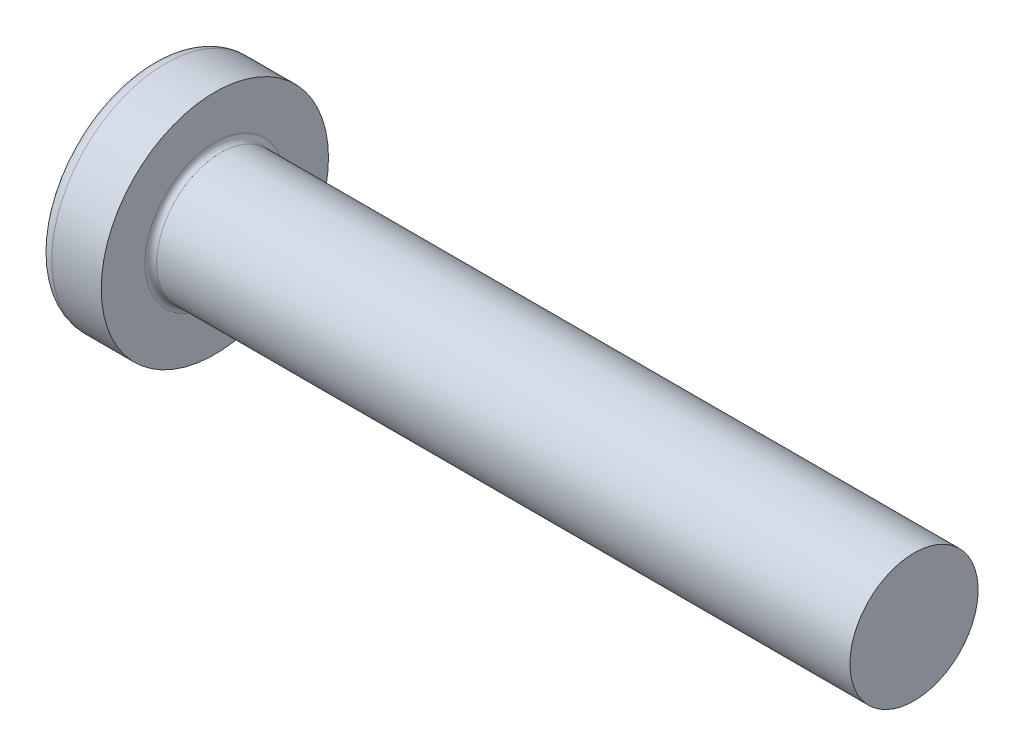
ISO-10303-21;
HEADER;
FILE_DESCRIPTION(('STEP AP214'),'2;1');
FILE_NAME('part.step','',(''),(''),'','','');
FILE_SCHEMA(('AUTOMOTIVE_DESIGN { 1 0 10303 214 1 1 1 1 }'));
ENDSEC;
DATA;
#1=APPLICATION_CONTEXT('core data for automotive mechanical design processes');
#2=APPLICATION_PROTOCOL_DEFINITION('international standard','automotive_design',2000,#1);
#3=PRODUCT_CONTEXT('',#1,'mechanical');
#4=PRODUCT('Part','Part','',(#3));
#5=PRODUCT_RELATED_PRODUCT_CATEGORY('part','',(#4));
#6=PRODUCT_DEFINITION_FORMATION('','',#4);
#7=PRODUCT_DEFINITION_CONTEXT('part definition',#1,'design');
#8=PRODUCT_DEFINITION('design','',#6,#7);
#9=PRODUCT_DEFINITION_SHAPE('','',#8);
#10=(LENGTH_UNIT() NAMED_UNIT(*) SI_UNIT(.MILLI.,.METRE.));
#11=(NAMED_UNIT(*) PLANE_ANGLE_UNIT() SI_UNIT($,.RADIAN.));
#12=(NAMED_UNIT(*) SI_UNIT($,.STERADIAN.) SOLID_ANGLE_UNIT());
#13=UNCERTAINTY_MEASURE_WITH_UNIT(LENGTH_MEASURE(1.E-05),#10,'distance_accuracy_value','');
#14=(GEOMETRIC_REPRESENTATION_CONTEXT(3) GLOBAL_UNCERTAINTY_ASSIGNED_CONTEXT((#13)) GLOBAL_UNIT_ASSIGNED_CONTEXT((#10,
#11,#12)) REPRESENTATION_CONTEXT('',''));
#15=CARTESIAN_POINT('',(0.,0.,0.));
#16=DIRECTION('',(0.,0.,1.));
#17=DIRECTION('',(1.,0.,0.));
#18=AXIS2_PLACEMENT_3D('',#15,#16,#17);
#19=CARTESIAN_POINT('',(1.2,0.601702090980209,-0.3));
#20=DIRECTION('',(-1.,0.,0.));
#21=DIRECTION('',(0.,0.,1.));
#22=AXIS2_PLACEMENT_3D('',#19,#20,#21);
#23=PLANE('',#22);
#24=DIRECTION('',(0.,0.,-1.));
#25=VECTOR('',#24,1.);
#26=CARTESIAN_POINT('',(1.2,0.299999999999998,0.60170209098021));
#27=LINE('',#26,#25);
#28=CARTESIAN_POINT('',(1.2,0.300000000000002,-0.601702090980208));
#29=VERTEX_POINT('',#28);
#30=CARTESIAN_POINT('',(1.19999999999144,0.300000000000002,-0.468119642828335));
#31=VERTEX_POINT('',#30);
#32=EDGE_CURVE('E271',#29,#31,#27,.F.);
#33=ORIENTED_EDGE('',*,*,#32,.F.);
#34=DIRECTION('',(0.,1.,0.));
#35=VECTOR('',#34,1.);
#36=CARTESIAN_POINT('',(1.2,0.300000000000004,-0.601702090980208));
#37=LINE('',#36,#35);
#38=CARTESIAN_POINT('',(1.2,-0.299999999999998,-0.60170209098021));
#39=VERTEX_POINT('',#38);
#40=EDGE_CURVE('E276',#29,#39,#37,.F.);
#41=ORIENTED_EDGE('',*,*,#40,.T.);
#42=DIRECTION('',(0.,0.,1.));
#43=VECTOR('',#42,1.);
#44=CARTESIAN_POINT('',(1.2,-0.299999999999998,-0.601702090980211));
#45=LINE('',#44,#43);
#46=CARTESIAN_POINT('',(1.19999999999144,-0.299999999999999,-0.468119642828337));
#47=VERTEX_POINT('',#46);
#48=EDGE_CURVE('E323',#47,#39,#45,.F.);
#49=ORIENTED_EDGE('',*,*,#48,.F.);
#50=CARTESIAN_POINT('',(1.19999999999988,0.,0.));
#51=DIRECTION('',(-1.,0.,0.));
#52=DIRECTION('',(0.,0.,1.));
#53=AXIS2_PLACEMENT_3D('',#50,#51,#52);
#54=CIRCLE('',#53,0.556000000000001);
#55=EDGE_CURVE('E545',#47,#31,#54,.F.);
#56=ORIENTED_EDGE('',*,*,#55,.T.);
#57=EDGE_LOOP('',(#33,#41,#49,#56));
#58=FACE_BOUND('',#57,.T.);
#59=ADVANCED_FACE('F18',(#58),#23,.T.);
#60=CARTESIAN_POINT('',(1.2,0.601702090980209,-0.3));
#61=DIRECTION('',(-1.,0.,0.));
#62=DIRECTION('',(0.,0.,1.));
#63=AXIS2_PLACEMENT_3D('',#60,#61,#62);
#64=PLANE('',#63);
#65=DIRECTION('',(0.,1.,0.));
#66=VECTOR('',#65,1.);
#67=CARTESIAN_POINT('',(1.2,-0.60170209098021,0.3));
#68=LINE('',#67,#66);
#69=CARTESIAN_POINT('',(1.2,0.601702090980209,0.3));
#70=VERTEX_POINT('',#69);
#71=CARTESIAN_POINT('',(1.19999999999144,0.468119642828336,0.3));
#72=VERTEX_POINT('',#71);
#73=EDGE_CURVE('E141',#70,#72,#68,.F.);
#74=ORIENTED_EDGE('',*,*,#73,.F.);
#75=DIRECTION('',(0.,0.,1.));
#76=VECTOR('',#75,1.);
#77=CARTESIAN_POINT('',(1.2,0.601702090980209,0.3));
#78=LINE('',#77,#76);
#79=CARTESIAN_POINT('',(1.2,0.601702090980209,-0.3));
#80=VERTEX_POINT('',#79);
#81=EDGE_CURVE('E264',#70,#80,#78,.F.);
#82=ORIENTED_EDGE('',*,*,#81,.T.);
#83=DIRECTION('',(0.,1.,0.));
#84=VECTOR('',#83,1.);
#85=CARTESIAN_POINT('',(1.2,0.601702090980209,-0.3));
#86=LINE('',#85,#84);
#87=CARTESIAN_POINT('',(1.19999999999144,0.468119642828336,-0.3));
#88=VERTEX_POINT('',#87);
#89=EDGE_CURVE('E144',#88,#80,#86,.T.);
#90=ORIENTED_EDGE('',*,*,#89,.F.);
#91=CARTESIAN_POINT('',(1.19999999999988,0.,0.));
#92=DIRECTION('',(-1.,0.,0.));
#93=DIRECTION('',(0.,0.,1.));
#94=AXIS2_PLACEMENT_3D('',#91,#92,#93);
#95=CIRCLE('',#94,0.556000000000001);
#96=EDGE_CURVE('E138',#88,#72,#95,.F.);
#97=ORIENTED_EDGE('',*,*,#96,.T.);
#98=EDGE_LOOP('',(#74,#82,#90,#97));
#99=FACE_BOUND('',#98,.T.);
#100=ADVANCED_FACE('F140',(#99),#64,.T.);
#101=CARTESIAN_POINT('',(1.2,0.601702090980209,-0.3));
#102=DIRECTION('',(-1.,0.,0.));
#103=DIRECTION('',(0.,0.,1.));
#104=AXIS2_PLACEMENT_3D('',#101,#102,#103);
#105=PLANE('',#104);
#106=DIRECTION('',(0.,0.,1.));
#107=VECTOR('',#106,1.);
#108=CARTESIAN_POINT('',(1.2,-0.299999999999998,-0.601702090980211));
#109=LINE('',#108,#107);
#110=CARTESIAN_POINT('',(1.2,-0.300000000000002,0.601702090980208));
#111=VERTEX_POINT('',#110);
#112=CARTESIAN_POINT('',(1.19999999999144,-0.300000000000002,0.468119642828335));
#113=VERTEX_POINT('',#112);
#114=EDGE_CURVE('E252',#111,#113,#109,.F.);
#115=ORIENTED_EDGE('',*,*,#114,.F.);
#116=DIRECTION('',(0.,1.,0.));
#117=VECTOR('',#116,1.);
#118=CARTESIAN_POINT('',(1.2,-0.300000000000002,0.601702090980208));
#119=LINE('',#118,#117);
#120=CARTESIAN_POINT('',(1.2,0.299999999999998,0.60170209098021));
#121=VERTEX_POINT('',#120);
#122=EDGE_CURVE('E257',#111,#121,#119,.T.);
#123=ORIENTED_EDGE('',*,*,#122,.T.);
#124=DIRECTION('',(0.,0.,-1.));
#125=VECTOR('',#124,1.);
#126=CARTESIAN_POINT('',(1.2,0.299999999999998,0.60170209098021));
#127=LINE('',#126,#125);
#128=CARTESIAN_POINT('',(1.19999999999144,0.299999999999999,0.468119642828338));
#129=VERTEX_POINT('',#128);
#130=EDGE_CURVE('E301',#129,#121,#127,.F.);
#131=ORIENTED_EDGE('',*,*,#130,.F.);
#132=CARTESIAN_POINT('',(1.19999999999988,0.,0.));
#133=DIRECTION('',(-1.,0.,0.));
#134=DIRECTION('',(0.,0.,1.));
#135=AXIS2_PLACEMENT_3D('',#132,#133,#134);
#136=CIRCLE('',#135,0.556000000000001);
#137=EDGE_CURVE('E150',#129,#113,#136,.F.);
#138=ORIENTED_EDGE('',*,*,#137,.T.);
#139=EDGE_LOOP('',(#115,#123,#131,#138));
#140=FACE_BOUND('',#139,.T.);
#141=ADVANCED_FACE('F560',(#140),#105,.T.);
#142=CARTESIAN_POINT('',(1.20000000000031,0.,0.));
#143=DIRECTION('',(-1.,0.,0.));
#144=DIRECTION('',(0.,0.,1.));
#145=AXIS2_PLACEMENT_3D('',#142,#143,#144);
#146=CONICAL_SURFACE('',#145,0.555999999998669,1.25663706143256);
#147=CARTESIAN_POINT('',(1.38065535110554,0.,0.));
#148=VERTEX_POINT('',#147);
#149=VERTEX_LOOP('',#148);
#150=FACE_BOUND('',#149,.T.);
#151=CARTESIAN_POINT('',(1.19999999998299,0.,0.));
#152=DIRECTION('',(-1.,0.,0.));
#153=DIRECTION('',(0.,0.,1.));
#154=AXIS2_PLACEMENT_3D('',#151,#152,#153);
#155=CIRCLE('',#154,0.55600000000311);
#156=EDGE_CURVE('E270',#88,#31,#155,.T.);
#157=ORIENTED_EDGE('',*,*,#156,.T.);
#158=ORIENTED_EDGE('',*,*,#55,.F.);
#159=CARTESIAN_POINT('',(1.19999999998299,0.,0.));
#160=DIRECTION('',(-1.,0.,0.));
#161=DIRECTION('',(0.,0.,1.));
#162=AXIS2_PLACEMENT_3D('',#159,#160,#161);
#163=CIRCLE('',#162,0.55600000000311);
#164=CARTESIAN_POINT('',(1.19999999999144,-0.468119642828336,-0.300000000000001));
#165=VERTEX_POINT('',#164);
#166=EDGE_CURVE('E331',#47,#165,#163,.T.);
#167=ORIENTED_EDGE('',*,*,#166,.T.);
#168=CARTESIAN_POINT('',(1.19999999999988,0.,0.));
#169=DIRECTION('',(-1.,0.,0.));
#170=DIRECTION('',(0.,0.,1.));
#171=AXIS2_PLACEMENT_3D('',#168,#169,#170);
#172=CIRCLE('',#171,0.556000000000001);
#173=CARTESIAN_POINT('',(1.19999999999144,-0.468119642828336,0.3));
#174=VERTEX_POINT('',#173);
#175=EDGE_CURVE('E291',#174,#165,#172,.F.);
#176=ORIENTED_EDGE('',*,*,#175,.F.);
#177=CARTESIAN_POINT('',(1.19999999998299,0.,0.));
#178=DIRECTION('',(-1.,0.,0.));
#179=DIRECTION('',(0.,0.,1.));
#180=AXIS2_PLACEMENT_3D('',#177,#178,#179);
#181=CIRCLE('',#180,0.55600000000311);
#182=EDGE_CURVE('E251',#174,#113,#181,.T.);
#183=ORIENTED_EDGE('',*,*,#182,.T.);
#184=ORIENTED_EDGE('',*,*,#137,.F.);
#185=CARTESIAN_POINT('',(1.19999999998299,0.,0.));
#186=DIRECTION('',(-1.,0.,0.));
#187=DIRECTION('',(0.,0.,1.));
#188=AXIS2_PLACEMENT_3D('',#185,#186,#187);
#189=CIRCLE('',#188,0.55600000000311);
#190=EDGE_CURVE('E163',#129,#72,#189,.T.);
#191=ORIENTED_EDGE('',*,*,#190,.T.);
#192=ORIENTED_EDGE('',*,*,#96,.F.);
#193=EDGE_LOOP('',(#157,#158,#167,#176,#183,#184,#191,#192));
#194=FACE_BOUND('',#193,.T.);
#195=ADVANCED_FACE('F164',(#150,#194),#146,.F.);
#196=CARTESIAN_POINT('',(1.2,0.601702090980209,-0.3));
#197=DIRECTION('',(-1.,0.,0.));
#198=DIRECTION('',(0.,0.,1.));
#199=AXIS2_PLACEMENT_3D('',#196,#197,#198);
#200=PLANE('',#199);
#201=DIRECTION('',(0.,1.,0.));
#202=VECTOR('',#201,1.);
#203=CARTESIAN_POINT('',(1.2,0.601702090980209,-0.3));
#204=LINE('',#203,#202);
#205=CARTESIAN_POINT('',(1.2,-0.601702090980209,-0.3));
#206=VERTEX_POINT('',#205);
#207=EDGE_CURVE('E287',#206,#165,#204,.T.);
#208=ORIENTED_EDGE('',*,*,#207,.F.);
#209=DIRECTION('',(0.,0.,1.));
#210=VECTOR('',#209,1.);
#211=CARTESIAN_POINT('',(1.2,-0.601702090980209,-0.3));
#212=LINE('',#211,#210);
#213=CARTESIAN_POINT('',(1.2,-0.601702090980209,0.3));
#214=VERTEX_POINT('',#213);
#215=EDGE_CURVE('E239',#206,#214,#212,.T.);
#216=ORIENTED_EDGE('',*,*,#215,.T.);
#217=DIRECTION('',(0.,1.,0.));
#218=VECTOR('',#217,1.);
#219=CARTESIAN_POINT('',(1.2,-0.60170209098021,0.3));
#220=LINE('',#219,#218);
#221=EDGE_CURVE('E245',#174,#214,#220,.F.);
#222=ORIENTED_EDGE('',*,*,#221,.F.);
#223=ORIENTED_EDGE('',*,*,#175,.T.);
#224=EDGE_LOOP('',(#208,#216,#222,#223));
#225=FACE_BOUND('',#224,.T.);
#226=ADVANCED_FACE('F549',(#225),#200,.T.);
#227=CARTESIAN_POINT('',(1.2,0.601702090980209,-0.3));
#228=DIRECTION('',(0.,0.,1.));
#229=DIRECTION('',(1.,0.,0.));
#230=AXIS2_PLACEMENT_3D('',#227,#228,#229);
#231=PLANE('',#230);
#232=CARTESIAN_POINT('',(0.170303564593852,-1.1150897778374,-0.300000000000001));
#233=CARTESIAN_POINT('',(0.143844871789511,-1.02418894622975,-0.300000000000001));
#234=CARTESIAN_POINT('',(0.120668732118598,-0.932580739405694,-0.300000000000001));
#235=CARTESIAN_POINT('',(0.0808815590436282,-0.747949575324762,-0.299999999999999));
#236=CARTESIAN_POINT('',(0.0642705256395715,-0.654926618067887,-0.299999999999998));
#237=CARTESIAN_POINT('',(0.050942045368943,-0.561196285594605,-0.299999999999996));
#238=B_SPLINE_CURVE_WITH_KNOTS('',3,(#232,#233,#234,#235,#236,#237),.UNSPECIFIED.,.F.,.F.,(4,2,
4),(0.,0.283483285341631,0.566966570683263),.UNSPECIFIED.);
#239=CARTESIAN_POINT('',(0.170303564593852,-1.1150897778374,-0.3));
#240=VERTEX_POINT('',#239);
#241=CARTESIAN_POINT('',(0.0509420453854122,-0.561196285594247,-0.3));
#242=VERTEX_POINT('',#241);
#243=EDGE_CURVE('E238',#240,#242,#238,.T.);
#244=ORIENTED_EDGE('',*,*,#243,.F.);
#245=DIRECTION('',(0.89493436774996,0.446197800778958,0.));
#246=VECTOR('',#245,1.);
#247=CARTESIAN_POINT('',(0.,-1.2,-0.3));
#248=LINE('',#247,#246);
#249=EDGE_CURVE('E242',#240,#206,#248,.T.);
#250=ORIENTED_EDGE('',*,*,#249,.T.);
#251=ORIENTED_EDGE('',*,*,#207,.T.);
#252=CARTESIAN_POINT('',(1.19999999999161,-0.468119642829467,-0.3));
#253=CARTESIAN_POINT('',(1.00851907507673,-0.483987286215539,-0.3));
#254=CARTESIAN_POINT('',(0.817023777523635,-0.499677495244487,-0.3));
#255=CARTESIAN_POINT('',(0.434004459316412,-0.530703042791877,-0.3));
#256=CARTESIAN_POINT('',(0.242480438665611,-0.546038381351409,-0.3));
#257=CARTESIAN_POINT('',(0.0509420453799313,-0.561196285594909,-0.3));
#258=B_SPLINE_CURVE_WITH_KNOTS('',3,(#252,#253,#254,#255,#256,#257),.UNSPECIFIED.,.F.,.F.,(4,2,
4),(0.,0.576411038061277,1.15282200937849),.UNSPECIFIED.);
#259=EDGE_CURVE('E290',#165,#242,#258,.T.);
#260=ORIENTED_EDGE('',*,*,#259,.T.);
#261=EDGE_LOOP('',(#244,#250,#251,#260));
#262=FACE_BOUND('',#261,.T.);
#263=ADVANCED_FACE('F471',(#262),#231,.T.);
#264=CARTESIAN_POINT('',(0.0509420453909115,0.,0.));
#265=DIRECTION('',(-1.,0.,0.));
#266=DIRECTION('',(0.,0.,1.));
#267=AXIS2_PLACEMENT_3D('',#264,#265,#266);
#268=CONICAL_SURFACE('',#267,0.636349959506788,0.0698131700803994);
#269=CARTESIAN_POINT('',(0.0509420453725655,-0.299999999999998,-0.561196285595267));
#270=CARTESIAN_POINT('',(0.242480438660424,-0.299999999999998,-0.546038381351641));
#271=CARTESIAN_POINT('',(0.434004459313407,-0.299999999999998,-0.530703042792013));
#272=CARTESIAN_POINT('',(0.817023777524997,-0.299999999999998,-0.499677495244487));
#273=CARTESIAN_POINT('',(1.00851907508028,-0.299999999999998,-0.4839872862155));
#274=CARTESIAN_POINT('',(1.19999999999735,-0.299999999999998,-0.468119642829418));
#275=B_SPLINE_CURVE_WITH_KNOTS('',3,(#269,#270,#271,#272,#273,#274),.UNSPECIFIED.,.F.,.F.,(4,2,
4),(0.,0.576410971323761,1.15282200939158),.UNSPECIFIED.);
#276=CARTESIAN_POINT('',(0.0509420453817383,-0.299999999999998,-0.561196285633383));
#277=VERTEX_POINT('',#276);
#278=EDGE_CURVE('E328',#277,#47,#275,.T.);
#279=ORIENTED_EDGE('',*,*,#278,.F.);
#280=CARTESIAN_POINT('',(0.0509420453909115,0.,0.));
#281=DIRECTION('',(-1.,0.,0.));
#282=DIRECTION('',(0.,0.,1.));
#283=AXIS2_PLACEMENT_3D('',#280,#281,#282);
#284=CIRCLE('',#283,0.636349959506788);
#285=EDGE_CURVE('E463',#242,#277,#284,.F.);
#286=ORIENTED_EDGE('',*,*,#285,.F.);
#287=ORIENTED_EDGE('',*,*,#259,.F.);
#288=ORIENTED_EDGE('',*,*,#166,.F.);
#289=EDGE_LOOP('',(#279,#286,#287,#288));
#290=FACE_BOUND('',#289,.T.);
#291=ADVANCED_FACE('F444',(#290),#268,.F.);
#292=CARTESIAN_POINT('',(1.2,-0.299999999999998,-0.601702090980211));
#293=DIRECTION('',(0.,1.,0.));
#294=DIRECTION('',(0.,0.,1.));
#295=AXIS2_PLACEMENT_3D('',#292,#293,#294);
#296=PLANE('',#295);
#297=ORIENTED_EDGE('',*,*,#48,.T.);
#298=DIRECTION('',(-0.89493436774996,0.,-0.446197800778958));
#299=VECTOR('',#298,1.);
#300=CARTESIAN_POINT('',(0.,-0.299999999999998,-1.2));
#301=LINE('',#300,#299);
#302=CARTESIAN_POINT('',(0.170303564593854,-0.299999999999997,-1.1150897778374));
#303=VERTEX_POINT('',#302);
#304=EDGE_CURVE('E274',#39,#303,#301,.T.);
#305=ORIENTED_EDGE('',*,*,#304,.T.);
#306=CARTESIAN_POINT('',(4.,-0.299999999999998,0.));
#307=DIRECTION('',(0.,1.,0.));
#308=DIRECTION('',(0.,0.,1.));
#309=AXIS2_PLACEMENT_3D('',#306,#307,#308);
#310=CIRCLE('',#309,3.98873413503583);
#311=EDGE_CURVE('E461',#277,#303,#310,.F.);
#312=ORIENTED_EDGE('',*,*,#311,.F.);
#313=ORIENTED_EDGE('',*,*,#278,.T.);
#314=EDGE_LOOP('',(#297,#305,#312,#313));
#315=FACE_BOUND('',#314,.T.);
#316=ADVANCED_FACE('F446',(#315),#296,.T.);
#317=CARTESIAN_POINT('',(0.,0.300000000000004,-1.2));
#318=DIRECTION('',(0.446197800778958,0.,-0.89493436774996));
#319=DIRECTION('',(-0.89493436774996,0.,-0.446197800778958));
#320=AXIS2_PLACEMENT_3D('',#317,#318,#319);
#321=PLANE('',#320);
#322=ORIENTED_EDGE('',*,*,#40,.F.);
#323=DIRECTION('',(0.89493436774996,0.,0.446197800778958));
#324=VECTOR('',#323,1.);
#325=CARTESIAN_POINT('',(0.170303564593855,0.300000000000004,-1.1150897778374));
#326=LINE('',#325,#324);
#327=CARTESIAN_POINT('',(0.170303564593854,0.300000000000007,-1.1150897778374));
#328=VERTEX_POINT('',#327);
#329=EDGE_CURVE('E267',#328,#29,#326,.T.);
#330=ORIENTED_EDGE('',*,*,#329,.F.);
#331=CARTESIAN_POINT('',(0.170303564593854,-0.299999999999996,-1.1150897778374));
#332=CARTESIAN_POINT('',(0.163473050626689,-0.199999999999996,-1.11849534635747));
#333=CARTESIAN_POINT('',(0.160057793643106,-0.0999999999999963,-1.12019813061751));
#334=CARTESIAN_POINT('',(0.160057793643106,0.100000000000004,-1.12019813061751));
#335=CARTESIAN_POINT('',(0.163473050626689,0.200000000000004,-1.11849534635747));
#336=CARTESIAN_POINT('',(0.170303564593854,0.300000000000004,-1.1150897778374));
#337=B_SPLINE_CURVE_WITH_KNOTS('',3,(#331,#332,#333,#334,#335,#336),.UNSPECIFIED.,.F.,.F.,(4,2,
4),(0.,0.300218372340037,0.600436744680075),.UNSPECIFIED.);
#338=EDGE_CURVE('E455',#303,#328,#337,.T.);
#339=ORIENTED_EDGE('',*,*,#338,.F.);
#340=ORIENTED_EDGE('',*,*,#304,.F.);
#341=EDGE_LOOP('',(#322,#330,#339,#340));
#342=FACE_BOUND('',#341,.T.);
#343=ADVANCED_FACE('F449',(#342),#321,.F.);
#344=CARTESIAN_POINT('',(1.2,0.299999999999998,0.60170209098021));
#345=DIRECTION('',(0.,-1.,0.));
#346=DIRECTION('',(0.,0.,-1.));
#347=AXIS2_PLACEMENT_3D('',#344,#345,#346);
#348=PLANE('',#347);
#349=CARTESIAN_POINT('',(4.,0.300000000000004,0.));
#350=DIRECTION('',(0.,1.,0.));
#351=DIRECTION('',(0.,0.,1.));
#352=AXIS2_PLACEMENT_3D('',#349,#350,#351);
#353=CIRCLE('',#352,3.98873413503583);
#354=CARTESIAN_POINT('',(0.0509420453854116,0.300000000000003,-0.56119628563309));
#355=VERTEX_POINT('',#354);
#356=EDGE_CURVE('E409',#328,#355,#353,.T.);
#357=ORIENTED_EDGE('',*,*,#356,.F.);
#358=ORIENTED_EDGE('',*,*,#329,.T.);
#359=ORIENTED_EDGE('',*,*,#32,.T.);
#360=CARTESIAN_POINT('',(1.1999999999916,0.300000000000002,-0.468119642829467));
#361=CARTESIAN_POINT('',(1.00851907507671,0.300000000000002,-0.483987286215539));
#362=CARTESIAN_POINT('',(0.817023777523623,0.300000000000002,-0.499677495244487));
#363=CARTESIAN_POINT('',(0.434004459316406,0.300000000000002,-0.530703042791877));
#364=CARTESIAN_POINT('',(0.242480438665608,0.300000000000002,-0.546038381351408));
#365=CARTESIAN_POINT('',(0.0509420453799307,0.300000000000002,-0.561196285594908));
#366=B_SPLINE_CURVE_WITH_KNOTS('',3,(#360,#361,#362,#363,#364,#365),.UNSPECIFIED.,.F.,.F.,(4,2,
4),(0.,0.576411038061268,1.15282200937847),.UNSPECIFIED.);
#367=EDGE_CURVE('E317',#31,#355,#366,.T.);
#368=ORIENTED_EDGE('',*,*,#367,.T.);
#369=EDGE_LOOP('',(#357,#358,#359,#368));
#370=FACE_BOUND('',#369,.T.);
#371=ADVANCED_FACE('F424',(#370),#348,.T.);
#372=CARTESIAN_POINT('',(0.0509420453909115,0.,0.));
#373=DIRECTION('',(-1.,0.,0.));
#374=DIRECTION('',(0.,0.,1.));
#375=AXIS2_PLACEMENT_3D('',#372,#373,#374);
#376=CONICAL_SURFACE('',#375,0.636349959506788,0.0698131700803994);
#377=ORIENTED_EDGE('',*,*,#367,.F.);
#378=ORIENTED_EDGE('',*,*,#156,.F.);
#379=CARTESIAN_POINT('',(0.0509420453725669,0.561196285595266,-0.3));
#380=CARTESIAN_POINT('',(0.242480438660426,0.54603838135164,-0.3));
#381=CARTESIAN_POINT('',(0.434004459313408,0.530703042792011,-0.3));
#382=CARTESIAN_POINT('',(0.817023777524997,0.499677495244486,-0.3));
#383=CARTESIAN_POINT('',(1.00851907508028,0.483987286215499,-0.3));
#384=CARTESIAN_POINT('',(1.19999999999735,0.468119642829417,-0.3));
#385=B_SPLINE_CURVE_WITH_KNOTS('',3,(#379,#380,#381,#382,#383,#384),.UNSPECIFIED.,.F.,.F.,(4,2,
4),(0.,0.57641097132376,1.15282200939158),.UNSPECIFIED.);
#386=CARTESIAN_POINT('',(0.0509420453706864,0.561196285594447,-0.3));
#387=VERTEX_POINT('',#386);
#388=EDGE_CURVE('E188',#387,#88,#385,.T.);
#389=ORIENTED_EDGE('',*,*,#388,.F.);
#390=CARTESIAN_POINT('',(0.0509420453909115,0.,0.));
#391=DIRECTION('',(-1.,0.,0.));
#392=DIRECTION('',(0.,0.,1.));
#393=AXIS2_PLACEMENT_3D('',#390,#391,#392);
#394=CIRCLE('',#393,0.636349959506788);
#395=EDGE_CURVE('E408',#355,#387,#394,.F.);
#396=ORIENTED_EDGE('',*,*,#395,.F.);
#397=EDGE_LOOP('',(#377,#378,#389,#396));
#398=FACE_BOUND('',#397,.T.);
#399=ADVANCED_FACE('F418',(#398),#376,.F.);
#400=CARTESIAN_POINT('',(1.2,0.601702090980209,-0.3));
#401=DIRECTION('',(0.,0.,1.));
#402=DIRECTION('',(1.,0.,0.));
#403=AXIS2_PLACEMENT_3D('',#400,#401,#402);
#404=PLANE('',#403);
#405=ORIENTED_EDGE('',*,*,#89,.T.);
#406=DIRECTION('',(-0.89493436774996,0.446197800778958,0.));
#407=VECTOR('',#406,1.);
#408=CARTESIAN_POINT('',(1.2,0.601702090980209,-0.3));
#409=LINE('',#408,#407);
#410=CARTESIAN_POINT('',(0.170303564593856,1.1150897778374,-0.3));
#411=VERTEX_POINT('',#410);
#412=EDGE_CURVE('E160',#80,#411,#409,.T.);
#413=ORIENTED_EDGE('',*,*,#412,.T.);
#414=CARTESIAN_POINT('',(0.0509420453688059,0.561196285593629,-0.299999999999999));
#415=CARTESIAN_POINT('',(0.0642705256394338,0.65492661806708,-0.299999999999999));
#416=CARTESIAN_POINT('',(0.0808815590435021,0.747949575324119,-0.3));
#417=CARTESIAN_POINT('',(0.120668732118519,0.932580739405378,-0.3));
#418=CARTESIAN_POINT('',(0.143844871789468,1.0241889462296,-0.300000000000001));
#419=CARTESIAN_POINT('',(0.170303564593858,1.1150897778374,-0.300000000000002));
#420=B_SPLINE_CURVE_WITH_KNOTS('',3,(#414,#415,#416,#417,#418,#419),.UNSPECIFIED.,.F.,.F.,(4,2,
4),(0.,0.283483285342126,0.566966570684253),.UNSPECIFIED.);
#421=EDGE_CURVE('E405',#387,#411,#420,.T.);
#422=ORIENTED_EDGE('',*,*,#421,.F.);
#423=ORIENTED_EDGE('',*,*,#388,.T.);
#424=EDGE_LOOP('',(#405,#413,#422,#423));
#425=FACE_BOUND('',#424,.T.);
#426=ADVANCED_FACE('F415',(#425),#404,.T.);
#427=CARTESIAN_POINT('',(1.2,0.601702090980209,0.3));
#428=DIRECTION('',(0.446197800778958,0.89493436774996,0.));
#429=DIRECTION('',(-0.89493436774996,0.446197800778958,0.));
#430=AXIS2_PLACEMENT_3D('',#427,#428,#429);
#431=PLANE('',#430);
#432=ORIENTED_EDGE('',*,*,#81,.F.);
#433=DIRECTION('',(0.89493436774996,-0.446197800778958,0.));
#434=VECTOR('',#433,1.);
#435=CARTESIAN_POINT('',(0.170303564593856,1.1150897778374,0.3));
#436=LINE('',#435,#434);
#437=CARTESIAN_POINT('',(0.170303564593856,1.1150897778374,0.3));
#438=VERTEX_POINT('',#437);
#439=EDGE_CURVE('E159',#438,#70,#436,.T.);
#440=ORIENTED_EDGE('',*,*,#439,.F.);
#441=CARTESIAN_POINT('',(0.170303564593855,1.1150897778374,-0.3));
#442=CARTESIAN_POINT('',(0.163473050626689,1.11849534635747,-0.2));
#443=CARTESIAN_POINT('',(0.160057793643106,1.1201981306175,-0.1));
#444=CARTESIAN_POINT('',(0.160057793643109,1.12019813061751,0.100000000000001));
#445=CARTESIAN_POINT('',(0.163473050626695,1.11849534635748,0.200000000000003));
#446=CARTESIAN_POINT('',(0.170303564593865,1.11508977783742,0.300000000000004));
#447=B_SPLINE_CURVE_WITH_KNOTS('',3,(#441,#442,#443,#444,#445,#446),.UNSPECIFIED.,.F.,.F.,(4,2,
4),(0.,0.300218372340037,0.600436744680079),.UNSPECIFIED.);
#448=EDGE_CURVE('E210',#411,#438,#447,.T.);
#449=ORIENTED_EDGE('',*,*,#448,.F.);
#450=ORIENTED_EDGE('',*,*,#412,.F.);
#451=EDGE_LOOP('',(#432,#440,#449,#450));
#452=FACE_BOUND('',#451,.T.);
#453=ADVANCED_FACE('F199',(#452),#431,.F.);
#454=CARTESIAN_POINT('',(1.2,-0.60170209098021,0.3));
#455=DIRECTION('',(0.,0.,-1.));
#456=DIRECTION('',(-1.,0.,0.));
#457=AXIS2_PLACEMENT_3D('',#454,#455,#456);
#458=PLANE('',#457);
#459=CARTESIAN_POINT('',(0.170303564593855,1.1150897778374,0.299999999999999));
#460=CARTESIAN_POINT('',(0.143844871789512,1.02418894622975,0.3));
#461=CARTESIAN_POINT('',(0.120668732118598,0.932580739405692,0.300000000000001));
#462=CARTESIAN_POINT('',(0.080881559043628,0.747949575324758,0.299999999999999));
#463=CARTESIAN_POINT('',(0.0642705256395718,0.654926618067883,0.299999999999998));
#464=CARTESIAN_POINT('',(0.0509420453689447,0.561196285594599,0.299999999999995));
#465=B_SPLINE_CURVE_WITH_KNOTS('',3,(#459,#460,#461,#462,#463,#464),.UNSPECIFIED.,.F.,.F.,(4,2,
4),(0.,0.283483285341634,0.566966570683268),.UNSPECIFIED.);
#466=CARTESIAN_POINT('',(0.0509420453854125,0.561196285594247,0.3));
#467=VERTEX_POINT('',#466);
#468=EDGE_CURVE('E203',#438,#467,#465,.T.);
#469=ORIENTED_EDGE('',*,*,#468,.F.);
#470=ORIENTED_EDGE('',*,*,#439,.T.);
#471=ORIENTED_EDGE('',*,*,#73,.T.);
#472=CARTESIAN_POINT('',(1.19999999999161,0.468119642829467,0.3));
#473=CARTESIAN_POINT('',(1.00851907507673,0.483987286215539,0.3));
#474=CARTESIAN_POINT('',(0.817023777523635,0.499677495244488,0.3));
#475=CARTESIAN_POINT('',(0.434004459316413,0.530703042791877,0.3));
#476=CARTESIAN_POINT('',(0.242480438665612,0.546038381351409,0.3));
#477=CARTESIAN_POINT('',(0.0509420453799318,0.561196285594909,0.3));
#478=B_SPLINE_CURVE_WITH_KNOTS('',3,(#472,#473,#474,#475,#476,#477),.UNSPECIFIED.,.F.,.F.,(4,2,
4),(0.,0.576411038061277,1.15282200937849),.UNSPECIFIED.);
#479=EDGE_CURVE('E157',#72,#467,#478,.T.);
#480=ORIENTED_EDGE('',*,*,#479,.T.);
#481=EDGE_LOOP('',(#469,#470,#471,#480));
#482=FACE_BOUND('',#481,.T.);
#483=ADVANCED_FACE('F155',(#482),#458,.T.);
#484=CARTESIAN_POINT('',(0.0509420453909115,0.,0.));
#485=DIRECTION('',(-1.,0.,0.));
#486=DIRECTION('',(0.,0.,1.));
#487=AXIS2_PLACEMENT_3D('',#484,#485,#486);
#488=CONICAL_SURFACE('',#487,0.636349959506788,0.0698131700803994);
#489=CARTESIAN_POINT('',(0.0509420453725659,0.299999999999998,0.561196285595267));
#490=CARTESIAN_POINT('',(0.242480438660425,0.299999999999998,0.546038381351641));
#491=CARTESIAN_POINT('',(0.434004459313407,0.299999999999998,0.530703042792012));
#492=CARTESIAN_POINT('',(0.817023777524997,0.299999999999998,0.499677495244487));
#493=CARTESIAN_POINT('',(1.00851907508028,0.299999999999998,0.4839872862155));
#494=CARTESIAN_POINT('',(1.19999999999735,0.299999999999998,0.468119642829418));
#495=B_SPLINE_CURVE_WITH_KNOTS('',3,(#489,#490,#491,#492,#493,#494),.UNSPECIFIED.,.F.,.F.,(4,2,
4),(0.,0.576410971323761,1.15282200939158),.UNSPECIFIED.);
#496=CARTESIAN_POINT('',(0.0509420453817385,0.299999999999998,0.561196285633383));
#497=VERTEX_POINT('',#496);
#498=EDGE_CURVE('E168',#497,#129,#495,.T.);
#499=ORIENTED_EDGE('',*,*,#498,.F.);
#500=CARTESIAN_POINT('',(0.0509420453909115,0.,0.));
#501=DIRECTION('',(-1.,0.,0.));
#502=DIRECTION('',(0.,0.,1.));
#503=AXIS2_PLACEMENT_3D('',#500,#501,#502);
#504=CIRCLE('',#503,0.636349959506788);
#505=EDGE_CURVE('E172',#467,#497,#504,.F.);
#506=ORIENTED_EDGE('',*,*,#505,.F.);
#507=ORIENTED_EDGE('',*,*,#479,.F.);
#508=ORIENTED_EDGE('',*,*,#190,.F.);
#509=EDGE_LOOP('',(#499,#506,#507,#508));
#510=FACE_BOUND('',#509,.T.);
#511=ADVANCED_FACE('F170',(#510),#488,.F.);
#512=CARTESIAN_POINT('',(1.2,0.299999999999998,0.60170209098021));
#513=DIRECTION('',(0.,-1.,0.));
#514=DIRECTION('',(0.,0.,-1.));
#515=AXIS2_PLACEMENT_3D('',#512,#513,#514);
#516=PLANE('',#515);
#517=ORIENTED_EDGE('',*,*,#130,.T.);
#518=DIRECTION('',(0.89493436774996,0.,-0.446197800778958));
#519=VECTOR('',#518,1.);
#520=CARTESIAN_POINT('',(1.2,0.299999999999998,0.60170209098021));
#521=LINE('',#520,#519);
#522=CARTESIAN_POINT('',(0.170303564593855,0.299999999999997,1.1150897778374));
#523=VERTEX_POINT('',#522);
#524=EDGE_CURVE('E255',#121,#523,#521,.F.);
#525=ORIENTED_EDGE('',*,*,#524,.T.);
#526=CARTESIAN_POINT('',(4.,0.299999999999998,0.));
#527=DIRECTION('',(0.,1.,0.));
#528=DIRECTION('',(0.,0.,1.));
#529=AXIS2_PLACEMENT_3D('',#526,#527,#528);
#530=CIRCLE('',#529,3.98873413503583);
#531=EDGE_CURVE('E397',#497,#523,#530,.T.);
#532=ORIENTED_EDGE('',*,*,#531,.F.);
#533=ORIENTED_EDGE('',*,*,#498,.T.);
#534=EDGE_LOOP('',(#517,#525,#532,#533));
#535=FACE_BOUND('',#534,.T.);
#536=ADVANCED_FACE('F388',(#535),#516,.T.);
#537=CARTESIAN_POINT('',(1.2,-0.300000000000002,0.601702090980208));
#538=DIRECTION('',(0.446197800778958,0.,0.89493436774996));
#539=DIRECTION('',(0.89493436774996,0.,-0.446197800778958));
#540=AXIS2_PLACEMENT_3D('',#537,#538,#539);
#541=PLANE('',#540);
#542=ORIENTED_EDGE('',*,*,#122,.F.);
#543=DIRECTION('',(0.89493436774996,0.,-0.446197800778958));
#544=VECTOR('',#543,1.);
#545=CARTESIAN_POINT('',(0.170303564593854,-0.300000000000004,1.1150897778374));
#546=LINE('',#545,#544);
#547=CARTESIAN_POINT('',(0.170303564593853,-0.300000000000006,1.1150897778374));
#548=VERTEX_POINT('',#547);
#549=EDGE_CURVE('E248',#548,#111,#546,.T.);
#550=ORIENTED_EDGE('',*,*,#549,.F.);
#551=CARTESIAN_POINT('',(0.170303564593854,0.299999999999997,1.1150897778374));
#552=CARTESIAN_POINT('',(0.163473050626689,0.199999999999997,1.11849534635747));
#553=CARTESIAN_POINT('',(0.160057793643106,0.0999999999999964,1.12019813061751));
#554=CARTESIAN_POINT('',(0.160057793643106,-0.100000000000004,1.12019813061751));
#555=CARTESIAN_POINT('',(0.163473050626689,-0.200000000000004,1.11849534635747));
#556=CARTESIAN_POINT('',(0.170303564593855,-0.300000000000004,1.1150897778374));
#557=B_SPLINE_CURVE_WITH_KNOTS('',3,(#551,#552,#553,#554,#555,#556),.UNSPECIFIED.,.F.,.F.,(4,2,
4),(0.,0.300218372340038,0.600436744680076),.UNSPECIFIED.);
#558=EDGE_CURVE('E391',#523,#548,#557,.T.);
#559=ORIENTED_EDGE('',*,*,#558,.F.);
#560=ORIENTED_EDGE('',*,*,#524,.F.);
#561=EDGE_LOOP('',(#542,#550,#559,#560));
#562=FACE_BOUND('',#561,.T.);
#563=ADVANCED_FACE('F384',(#562),#541,.F.);
#564=CARTESIAN_POINT('',(1.2,-0.299999999999998,-0.601702090980211));
#565=DIRECTION('',(0.,1.,0.));
#566=DIRECTION('',(0.,0.,1.));
#567=AXIS2_PLACEMENT_3D('',#564,#565,#566);
#568=PLANE('',#567);
#569=CARTESIAN_POINT('',(4.,-0.300000000000004,0.));
#570=DIRECTION('',(0.,1.,0.));
#571=DIRECTION('',(0.,0.,1.));
#572=AXIS2_PLACEMENT_3D('',#569,#570,#571);
#573=CIRCLE('',#572,3.98873413503583);
#574=CARTESIAN_POINT('',(0.0509420453854118,-0.300000000000003,0.561196285633092));
#575=VERTEX_POINT('',#574);
#576=EDGE_CURVE('E396',#548,#575,#573,.F.);
#577=ORIENTED_EDGE('',*,*,#576,.F.);
#578=ORIENTED_EDGE('',*,*,#549,.T.);
#579=ORIENTED_EDGE('',*,*,#114,.T.);
#580=CARTESIAN_POINT('',(1.1999999999916,-0.300000000000002,0.468119642829467));
#581=CARTESIAN_POINT('',(1.00851907507671,-0.300000000000002,0.483987286215539));
#582=CARTESIAN_POINT('',(0.817023777523623,-0.300000000000002,0.499677495244488));
#583=CARTESIAN_POINT('',(0.434004459316406,-0.300000000000002,0.530703042791877));
#584=CARTESIAN_POINT('',(0.242480438665608,-0.300000000000002,0.546038381351408));
#585=CARTESIAN_POINT('',(0.0509420453799307,-0.300000000000002,0.561196285594908));
#586=B_SPLINE_CURVE_WITH_KNOTS('',3,(#580,#581,#582,#583,#584,#585),.UNSPECIFIED.,.F.,.F.,(4,2,
4),(0.,0.576411038061268,1.15282200937847),.UNSPECIFIED.);
#587=EDGE_CURVE('E295',#113,#575,#586,.T.);
#588=ORIENTED_EDGE('',*,*,#587,.T.);
#589=EDGE_LOOP('',(#577,#578,#579,#588));
#590=FACE_BOUND('',#589,.T.);
#591=ADVANCED_FACE('F380',(#590),#568,.T.);
#592=CARTESIAN_POINT('',(0.0509420453909115,0.,0.));
#593=DIRECTION('',(-1.,0.,0.));
#594=DIRECTION('',(0.,0.,1.));
#595=AXIS2_PLACEMENT_3D('',#592,#593,#594);
#596=CONICAL_SURFACE('',#595,0.636349959506788,0.0698131700803994);
#597=ORIENTED_EDGE('',*,*,#587,.F.);
#598=ORIENTED_EDGE('',*,*,#182,.F.);
#599=CARTESIAN_POINT('',(0.0509420453725661,-0.561196285595266,0.3));
#600=CARTESIAN_POINT('',(0.242480438660425,-0.54603838135164,0.3));
#601=CARTESIAN_POINT('',(0.434004459313407,-0.530703042792012,0.3));
#602=CARTESIAN_POINT('',(0.817023777524997,-0.499677495244486,0.3));
#603=CARTESIAN_POINT('',(1.00851907508028,-0.483987286215499,0.3));
#604=CARTESIAN_POINT('',(1.19999999999735,-0.468119642829417,0.3));
#605=B_SPLINE_CURVE_WITH_KNOTS('',3,(#599,#600,#601,#602,#603,#604),.UNSPECIFIED.,.F.,.F.,(4,2,
4),(0.,0.576410971323761,1.15282200939158),.UNSPECIFIED.);
#606=CARTESIAN_POINT('',(0.050942045370686,-0.561196285594452,0.3));
#607=VERTEX_POINT('',#606);
#608=EDGE_CURVE('E281',#607,#174,#605,.T.);
#609=ORIENTED_EDGE('',*,*,#608,.F.);
#610=CARTESIAN_POINT('',(0.0509420453909115,0.,0.));
#611=DIRECTION('',(-1.,0.,0.));
#612=DIRECTION('',(0.,0.,1.));
#613=AXIS2_PLACEMENT_3D('',#610,#611,#612);
#614=CIRCLE('',#613,0.636349959506788);
#615=EDGE_CURVE('E355',#575,#607,#614,.F.);
#616=ORIENTED_EDGE('',*,*,#615,.F.);
#617=EDGE_LOOP('',(#597,#598,#609,#616));
#618=FACE_BOUND('',#617,.T.);
#619=ADVANCED_FACE('F361',(#618),#596,.F.);
#620=CARTESIAN_POINT('',(1.2,-0.60170209098021,0.3));
#621=DIRECTION('',(0.,0.,-1.));
#622=DIRECTION('',(-1.,0.,0.));
#623=AXIS2_PLACEMENT_3D('',#620,#621,#622);
#624=PLANE('',#623);
#625=ORIENTED_EDGE('',*,*,#221,.T.);
#626=DIRECTION('',(0.89493436774996,0.446197800778958,0.));
#627=VECTOR('',#626,1.);
#628=CARTESIAN_POINT('',(0.,-1.2,0.3));
#629=LINE('',#628,#627);
#630=CARTESIAN_POINT('',(0.170303564593852,-1.1150897778374,0.3));
#631=VERTEX_POINT('',#630);
#632=EDGE_CURVE('E236',#214,#631,#629,.F.);
#633=ORIENTED_EDGE('',*,*,#632,.T.);
#634=CARTESIAN_POINT('',(0.0509420453688059,-0.561196285593637,0.300000000000001));
#635=CARTESIAN_POINT('',(0.0642705256394333,-0.654926618067087,0.3));
#636=CARTESIAN_POINT('',(0.080881559043501,-0.747949575324125,0.3));
#637=CARTESIAN_POINT('',(0.120668732118517,-0.932580739405381,0.3));
#638=CARTESIAN_POINT('',(0.143844871789465,-1.0241889462296,0.3));
#639=CARTESIAN_POINT('',(0.170303564593854,-1.11508977783741,0.300000000000001));
#640=B_SPLINE_CURVE_WITH_KNOTS('',3,(#634,#635,#636,#637,#638,#639),.UNSPECIFIED.,.F.,.F.,(4,2,
4),(0.,0.283483285342122,0.566966570684245),.UNSPECIFIED.);
#641=EDGE_CURVE('E349',#607,#631,#640,.T.);
#642=ORIENTED_EDGE('',*,*,#641,.F.);
#643=ORIENTED_EDGE('',*,*,#608,.T.);
#644=EDGE_LOOP('',(#625,#633,#642,#643));
#645=FACE_BOUND('',#644,.T.);
#646=ADVANCED_FACE('F357',(#645),#624,.T.);
#647=CARTESIAN_POINT('',(0.,-1.2,-0.3));
#648=DIRECTION('',(0.446197800778958,-0.89493436774996,0.));
#649=DIRECTION('',(0.89493436774996,0.446197800778958,0.));
#650=AXIS2_PLACEMENT_3D('',#647,#648,#649);
#651=PLANE('',#650);
#652=ORIENTED_EDGE('',*,*,#215,.F.);
#653=ORIENTED_EDGE('',*,*,#249,.F.);
#654=CARTESIAN_POINT('',(0.170303564593852,-1.1150897778374,0.3));
#655=CARTESIAN_POINT('',(0.16347305062669,-1.11849534635748,0.2));
#656=CARTESIAN_POINT('',(0.160057793643111,-1.12019813061752,0.0999999999999996));
#657=CARTESIAN_POINT('',(0.160057793643113,-1.12019813061753,-0.100000000000002));
#658=CARTESIAN_POINT('',(0.163473050626697,-1.11849534635749,-0.200000000000004));
#659=CARTESIAN_POINT('',(0.170303564593861,-1.11508977783742,-0.300000000000005));
#660=B_SPLINE_CURVE_WITH_KNOTS('',3,(#654,#655,#656,#657,#658,#659),.UNSPECIFIED.,.F.,.F.,(4,2,
4),(0.,0.300218372340037,0.60043674468008),.UNSPECIFIED.);
#661=EDGE_CURVE('E344',#631,#240,#660,.T.);
#662=ORIENTED_EDGE('',*,*,#661,.F.);
#663=ORIENTED_EDGE('',*,*,#632,.F.);
#664=EDGE_LOOP('',(#652,#653,#662,#663));
#665=FACE_BOUND('',#664,.T.);
#666=ADVANCED_FACE('F223',(#665),#651,.F.);
#667=CARTESIAN_POINT('',(4.,0.,0.));
#668=DIRECTION('',(0.,1.,0.));
#669=DIRECTION('',(1.,0.,0.));
#670=AXIS2_PLACEMENT_3D('',#667,#668,#669);
#671=SPHERICAL_SURFACE('',#670,4.);
#672=CARTESIAN_POINT('',(0.437599524473592,0.,0.));
#673=DIRECTION('',(-1.,0.,0.));
#674=DIRECTION('',(0.,0.,1.));
#675=AXIS2_PLACEMENT_3D('',#672,#673,#674);
#676=CIRCLE('',#675,1.81914893617021);
#677=CARTESIAN_POINT('',(0.437599524473592,0.,1.81914893617021));
#678=VERTEX_POINT('',#677);
#679=EDGE_CURVE('E340',#678,#678,#676,.F.);
#680=ORIENTED_EDGE('',*,*,#679,.F.);
#681=EDGE_LOOP('',(#680));
#682=FACE_BOUND('',#681,.T.);
#683=ORIENTED_EDGE('',*,*,#641,.T.);
#684=ORIENTED_EDGE('',*,*,#661,.T.);
#685=ORIENTED_EDGE('',*,*,#243,.T.);
#686=ORIENTED_EDGE('',*,*,#285,.T.);
#687=ORIENTED_EDGE('',*,*,#311,.T.);
#688=ORIENTED_EDGE('',*,*,#338,.T.);
#689=ORIENTED_EDGE('',*,*,#356,.T.);
#690=ORIENTED_EDGE('',*,*,#395,.T.);
#691=ORIENTED_EDGE('',*,*,#421,.T.);
#692=ORIENTED_EDGE('',*,*,#448,.T.);
#693=ORIENTED_EDGE('',*,*,#468,.T.);
#694=ORIENTED_EDGE('',*,*,#505,.T.);
#695=ORIENTED_EDGE('',*,*,#531,.T.);
#696=ORIENTED_EDGE('',*,*,#558,.T.);
#697=ORIENTED_EDGE('',*,*,#576,.T.);
#698=ORIENTED_EDGE('',*,*,#615,.T.);
#699=EDGE_LOOP('',(#683,#684,#685,#686,#687,#688,#689,#690,#691,#692,#693,#694,#695,#696,#697,#698));
#700=FACE_BOUND('',#699,.T.);
#701=ADVANCED_FACE('F216',(#682,#700),#671,.T.);
#702=CARTESIAN_POINT('',(0.651343553005176,0.,0.));
#703=DIRECTION('',(-1.,0.,0.));
#704=DIRECTION('',(0.,0.,1.));
#705=AXIS2_PLACEMENT_3D('',#702,#703,#704);
#706=TOROIDAL_SURFACE('',#705,1.71,0.24);
#707=ORIENTED_EDGE('',*,*,#679,.T.);
#708=EDGE_LOOP('',(#707));
#709=FACE_BOUND('',#708,.T.);
#710=CARTESIAN_POINT('',(0.651343553005175,0.,0.));
#711=DIRECTION('',(-1.,0.,0.));
#712=DIRECTION('',(0.,0.,1.));
#713=AXIS2_PLACEMENT_3D('',#710,#711,#712);
#714=CIRCLE('',#713,1.95);
#715=CARTESIAN_POINT('',(0.651343553005175,0.,1.95));
#716=VERTEX_POINT('',#715);
#717=EDGE_CURVE('E343',#716,#716,#714,.F.);
#718=ORIENTED_EDGE('',*,*,#717,.F.);
#719=EDGE_LOOP('',(#718));
#720=FACE_BOUND('',#719,.T.);
#721=ADVANCED_FACE('F222',(#709,#720),#706,.T.);
#722=CARTESIAN_POINT('',(-25.4,0.,0.));
#723=DIRECTION('',(-1.,0.,0.));
#724=DIRECTION('',(0.,0.,1.));
#725=AXIS2_PLACEMENT_3D('',#722,#723,#724);
#726=CYLINDRICAL_SURFACE('',#725,1.95);
#727=ORIENTED_EDGE('',*,*,#717,.T.);
#728=EDGE_LOOP('',(#727));
#729=FACE_BOUND('',#728,.T.);
#730=CARTESIAN_POINT('',(1.5,0.,0.));
#731=DIRECTION('',(-1.,0.,0.));
#732=DIRECTION('',(0.,0.,1.));
#733=AXIS2_PLACEMENT_3D('',#730,#731,#732);
#734=CIRCLE('',#733,1.95);
#735=CARTESIAN_POINT('',(1.5,0.,1.95));
#736=VERTEX_POINT('',#735);
#737=EDGE_CURVE('E337',#736,#736,#734,.T.);
#738=ORIENTED_EDGE('',*,*,#737,.T.);
#739=EDGE_LOOP('',(#738));
#740=FACE_BOUND('',#739,.T.);
#741=ADVANCED_FACE('F521',(#729,#740),#726,.T.);
#742=CARTESIAN_POINT('',(1.5,1.1,0.));
#743=DIRECTION('',(-1.,0.,0.));
#744=DIRECTION('',(0.,0.,1.));
#745=AXIS2_PLACEMENT_3D('',#742,#743,#744);
#746=PLANE('',#745);
#747=ORIENTED_EDGE('',*,*,#737,.F.);
#748=EDGE_LOOP('',(#747));
#749=FACE_BOUND('',#748,.T.);
#750=CARTESIAN_POINT('',(1.5,0.,0.));
#751=DIRECTION('',(1.,0.,0.));
#752=DIRECTION('',(0.,0.,1.));
#753=AXIS2_PLACEMENT_3D('',#750,#751,#752);
#754=CIRCLE('',#753,1.2);
#755=CARTESIAN_POINT('',(1.5,0.,-1.2));
#756=VERTEX_POINT('',#755);
#757=CARTESIAN_POINT('',(1.5,0.,1.2));
#758=VERTEX_POINT('',#757);
#759=EDGE_CURVE('E336',#756,#758,#754,.F.);
#760=ORIENTED_EDGE('',*,*,#759,.T.);
#761=CARTESIAN_POINT('',(1.5,0.,0.));
#762=DIRECTION('',(1.,0.,0.));
#763=DIRECTION('',(0.,0.,-1.));
#764=AXIS2_PLACEMENT_3D('',#761,#762,#763);
#765=CIRCLE('',#764,1.2);
#766=EDGE_CURVE('E37',#756,#758,#765,.T.);
#767=ORIENTED_EDGE('',*,*,#766,.F.);
#768=EDGE_LOOP('',(#760,#767));
#769=FACE_BOUND('',#768,.T.);
#770=ADVANCED_FACE('F513',(#749,#769),#746,.F.);
#771=CARTESIAN_POINT('',(13.5,1.1,0.));
#772=DIRECTION('',(1.,0.,0.));
#773=DIRECTION('',(0.,0.,-1.));
#774=AXIS2_PLACEMENT_3D('',#771,#772,#773);
#775=PLANE('',#774);
#776=CARTESIAN_POINT('',(13.5,0.,0.));
#777=DIRECTION('',(-1.,0.,0.));
#778=DIRECTION('',(0.,0.,1.));
#779=AXIS2_PLACEMENT_3D('',#776,#777,#778);
#780=CIRCLE('',#779,1.1);
#781=CARTESIAN_POINT('',(13.5,0.,1.1));
#782=VERTEX_POINT('',#781);
#783=EDGE_CURVE('E29',#782,#782,#780,.T.);
#784=ORIENTED_EDGE('',*,*,#783,.F.);
#785=EDGE_LOOP('',(#784));
#786=FACE_BOUND('',#785,.T.);
#787=ADVANCED_FACE('F498',(#786),#775,.T.);
#788=CARTESIAN_POINT('',(1.6,0.,0.));
#789=DIRECTION('',(-1.,0.,0.));
#790=DIRECTION('',(0.,0.,1.));
#791=AXIS2_PLACEMENT_3D('',#788,#789,#790);
#792=TOROIDAL_SURFACE('',#791,1.2,0.1);
#793=ORIENTED_EDGE('',*,*,#766,.T.);
#794=ORIENTED_EDGE('',*,*,#759,.F.);
#795=EDGE_LOOP('',(#793,#794));
#796=FACE_BOUND('',#795,.T.);
#797=CARTESIAN_POINT('',(1.6,0.,0.));
#798=DIRECTION('',(-1.,0.,0.));
#799=DIRECTION('',(0.,0.,1.));
#800=AXIS2_PLACEMENT_3D('',#797,#798,#799);
#801=CIRCLE('',#800,1.1);
#802=CARTESIAN_POINT('',(1.6,0.,1.1));
#803=VERTEX_POINT('',#802);
#804=EDGE_CURVE('E11',#803,#803,#801,.F.);
#805=ORIENTED_EDGE('',*,*,#804,.F.);
#806=EDGE_LOOP('',(#805));
#807=FACE_BOUND('',#806,.T.);
#808=ADVANCED_FACE('F492',(#796,#807),#792,.F.);
#809=CARTESIAN_POINT('',(-25.4,0.,0.));
#810=DIRECTION('',(-1.,0.,0.));
#811=DIRECTION('',(0.,0.,1.));
#812=AXIS2_PLACEMENT_3D('',#809,#810,#811);
#813=CYLINDRICAL_SURFACE('',#812,1.1);
#814=ORIENTED_EDGE('',*,*,#783,.T.);
#815=EDGE_LOOP('',(#814));
#816=FACE_BOUND('',#815,.T.);
#817=ORIENTED_EDGE('',*,*,#804,.T.);
#818=EDGE_LOOP('',(#817));
#819=FACE_BOUND('',#818,.T.);
#820=ADVANCED_FACE('F490',(#816,#819),#813,.T.);
#821=CLOSED_SHELL('',(#59,#100,#141,#195,#226,#263,#291,#316,#343,#371,#399,#426,#453,#483,#511,
#536,#563,#591,#619,#646,#666,#701,#721,#741,#770,#787,#808,#820));
#822=MANIFOLD_SOLID_BREP('B1',#821);
#823=ADVANCED_BREP_SHAPE_REPRESENTATION('',(#18,#822),#14);
#824=SHAPE_DEFINITION_REPRESENTATION(#9,#823);
ENDSEC;
END-ISO-10303-21;
